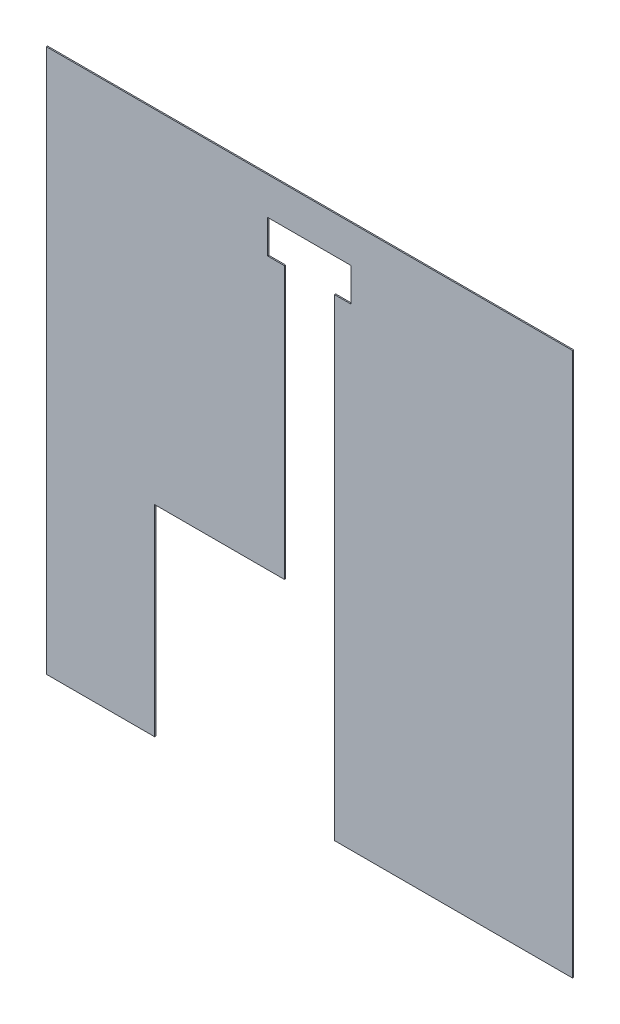
ISO-10303-21;
HEADER;
FILE_DESCRIPTION(('STEP AP214'),'2;1');
FILE_NAME('part.step','',(''),(''),'','','');
FILE_SCHEMA(('AUTOMOTIVE_DESIGN { 1 0 10303 214 1 1 1 1 }'));
ENDSEC;
DATA;
#1=APPLICATION_CONTEXT('core data for automotive mechanical design processes');
#2=APPLICATION_PROTOCOL_DEFINITION('international standard','automotive_design',2000,#1);
#3=PRODUCT_CONTEXT('',#1,'mechanical');
#4=PRODUCT('Part','Part','',(#3));
#5=PRODUCT_RELATED_PRODUCT_CATEGORY('part','',(#4));
#6=PRODUCT_DEFINITION_FORMATION('','',#4);
#7=PRODUCT_DEFINITION_CONTEXT('part definition',#1,'design');
#8=PRODUCT_DEFINITION('design','',#6,#7);
#9=PRODUCT_DEFINITION_SHAPE('','',#8);
#10=(LENGTH_UNIT() NAMED_UNIT(*) SI_UNIT(.MILLI.,.METRE.));
#11=(NAMED_UNIT(*) PLANE_ANGLE_UNIT() SI_UNIT($,.RADIAN.));
#12=(NAMED_UNIT(*) SI_UNIT($,.STERADIAN.) SOLID_ANGLE_UNIT());
#13=UNCERTAINTY_MEASURE_WITH_UNIT(LENGTH_MEASURE(1.E-05),#10,'distance_accuracy_value','');
#14=(GEOMETRIC_REPRESENTATION_CONTEXT(3) GLOBAL_UNCERTAINTY_ASSIGNED_CONTEXT((#13)) GLOBAL_UNIT_ASSIGNED_CONTEXT((#10,
#11,#12)) REPRESENTATION_CONTEXT('',''));
#15=CARTESIAN_POINT('',(0.,0.,0.));
#16=DIRECTION('',(0.,0.,1.));
#17=DIRECTION('',(1.,0.,0.));
#18=AXIS2_PLACEMENT_3D('',#15,#16,#17);
#19=CARTESIAN_POINT('',(1.59204083889156E-13,-1300.,2.9));
#20=DIRECTION('',(0.,1.,0.));
#21=DIRECTION('',(0.,0.,1.));
#22=AXIS2_PLACEMENT_3D('',#19,#20,#21);
#23=PLANE('',#22);
#24=DIRECTION('',(1.,0.,0.));
#25=VECTOR('',#24,1.);
#26=CARTESIAN_POINT('',(1.59204083889156E-13,-1300.,2.9));
#27=LINE('',#26,#25);
#28=CARTESIAN_POINT('',(689.2,-1300.,2.9));
#29=VERTEX_POINT('',#28);
#30=CARTESIAN_POINT('',(1258.4,-1300.,2.9));
#31=VERTEX_POINT('',#30);
#32=EDGE_CURVE('E185',#29,#31,#27,.T.);
#33=ORIENTED_EDGE('',*,*,#32,.F.);
#34=DIRECTION('',(0.,0.,1.));
#35=VECTOR('',#34,1.);
#36=CARTESIAN_POINT('',(689.2,-1300.,-0.1));
#37=LINE('',#36,#35);
#38=CARTESIAN_POINT('',(689.2,-1300.,0.));
#39=VERTEX_POINT('',#38);
#40=EDGE_CURVE('E241',#39,#29,#37,.T.);
#41=ORIENTED_EDGE('',*,*,#40,.F.);
#42=DIRECTION('',(1.,0.,0.));
#43=VECTOR('',#42,1.);
#44=CARTESIAN_POINT('',(1.59204083889156E-13,-1300.,0.));
#45=LINE('',#44,#43);
#46=CARTESIAN_POINT('',(1258.4,-1300.,0.));
#47=VERTEX_POINT('',#46);
#48=EDGE_CURVE('E197',#39,#47,#45,.T.);
#49=ORIENTED_EDGE('',*,*,#48,.T.);
#50=DIRECTION('',(0.,0.,-1.));
#51=VECTOR('',#50,1.);
#52=CARTESIAN_POINT('',(1258.4,-1300.,2.9));
#53=LINE('',#52,#51);
#54=EDGE_CURVE('E209',#31,#47,#53,.T.);
#55=ORIENTED_EDGE('',*,*,#54,.F.);
#56=EDGE_LOOP('',(#33,#41,#49,#55));
#57=FACE_BOUND('',#56,.T.);
#58=ADVANCED_FACE('F35',(#57),#23,.F.);
#59=CARTESIAN_POINT('',(529.2,-168.9,-7.1));
#60=DIRECTION('',(0.,-1.,0.));
#61=DIRECTION('',(1.,0.,0.));
#62=AXIS2_PLACEMENT_3D('',#59,#60,#61);
#63=PLANE('',#62);
#64=DIRECTION('',(1.,0.,0.));
#65=VECTOR('',#64,1.);
#66=CARTESIAN_POINT('',(0.,-168.9,0.));
#67=LINE('',#66,#65);
#68=CARTESIAN_POINT('',(689.2,-168.9,0.));
#69=VERTEX_POINT('',#68);
#70=CARTESIAN_POINT('',(729.2,-168.9,0.));
#71=VERTEX_POINT('',#70);
#72=EDGE_CURVE('E224',#69,#71,#67,.T.);
#73=ORIENTED_EDGE('',*,*,#72,.F.);
#74=DIRECTION('',(0.,0.,1.));
#75=VECTOR('',#74,1.);
#76=CARTESIAN_POINT('',(689.2,-168.9,-7.1));
#77=LINE('',#76,#75);
#78=CARTESIAN_POINT('',(689.2,-168.9,2.9));
#79=VERTEX_POINT('',#78);
#80=EDGE_CURVE('E143',#69,#79,#77,.T.);
#81=ORIENTED_EDGE('',*,*,#80,.T.);
#82=DIRECTION('',(1.,0.,0.));
#83=VECTOR('',#82,1.);
#84=CARTESIAN_POINT('',(529.2,-168.9,2.9));
#85=LINE('',#84,#83);
#86=CARTESIAN_POINT('',(729.2,-168.9,2.9));
#87=VERTEX_POINT('',#86);
#88=EDGE_CURVE('E160',#79,#87,#85,.T.);
#89=ORIENTED_EDGE('',*,*,#88,.T.);
#90=DIRECTION('',(0.,0.,1.));
#91=VECTOR('',#90,1.);
#92=CARTESIAN_POINT('',(729.2,-168.9,-7.1));
#93=LINE('',#92,#91);
#94=EDGE_CURVE('E173',#71,#87,#93,.T.);
#95=ORIENTED_EDGE('',*,*,#94,.F.);
#96=EDGE_LOOP('',(#73,#81,#89,#95));
#97=FACE_BOUND('',#96,.T.);
#98=ADVANCED_FACE('F275',(#97),#63,.F.);
#99=CARTESIAN_POINT('',(0.,0.,2.9));
#100=DIRECTION('',(1.,0.,0.));
#101=DIRECTION('',(0.,1.,0.));
#102=AXIS2_PLACEMENT_3D('',#99,#100,#101);
#103=PLANE('',#102);
#104=DIRECTION('',(0.,-1.,0.));
#105=VECTOR('',#104,1.);
#106=CARTESIAN_POINT('',(0.,0.,0.));
#107=LINE('',#106,#105);
#108=CARTESIAN_POINT('',(0.,0.,0.));
#109=VERTEX_POINT('',#108);
#110=CARTESIAN_POINT('',(1.59204083889156E-13,-1300.,0.));
#111=VERTEX_POINT('',#110);
#112=EDGE_CURVE('E175',#109,#111,#107,.T.);
#113=ORIENTED_EDGE('',*,*,#112,.T.);
#114=DIRECTION('',(0.,0.,-1.));
#115=VECTOR('',#114,1.);
#116=CARTESIAN_POINT('',(1.59204083889156E-13,-1300.,2.9));
#117=LINE('',#116,#115);
#118=CARTESIAN_POINT('',(1.59204083889156E-13,-1300.,2.9));
#119=VERTEX_POINT('',#118);
#120=EDGE_CURVE('E212',#119,#111,#117,.T.);
#121=ORIENTED_EDGE('',*,*,#120,.F.);
#122=DIRECTION('',(0.,-1.,0.));
#123=VECTOR('',#122,1.);
#124=CARTESIAN_POINT('',(0.,0.,2.9));
#125=LINE('',#124,#123);
#126=CARTESIAN_POINT('',(0.,0.,2.9));
#127=VERTEX_POINT('',#126);
#128=EDGE_CURVE('E182',#127,#119,#125,.T.);
#129=ORIENTED_EDGE('',*,*,#128,.F.);
#130=DIRECTION('',(0.,0.,-1.));
#131=VECTOR('',#130,1.);
#132=CARTESIAN_POINT('',(0.,0.,2.9));
#133=LINE('',#132,#131);
#134=EDGE_CURVE('E194',#127,#109,#133,.T.);
#135=ORIENTED_EDGE('',*,*,#134,.T.);
#136=EDGE_LOOP('',(#113,#121,#129,#135));
#137=FACE_BOUND('',#136,.T.);
#138=ADVANCED_FACE('F37',(#137),#103,.F.);
#139=CARTESIAN_POINT('',(259.2,-1300.,0.));
#140=VERTEX_POINT('',#139);
#141=EDGE_CURVE('E198',#111,#140,#45,.T.);
#142=ORIENTED_EDGE('',*,*,#141,.T.);
#143=DIRECTION('',(0.,0.,1.));
#144=VECTOR('',#143,1.);
#145=CARTESIAN_POINT('',(259.2,-1300.,-0.1));
#146=LINE('',#145,#144);
#147=CARTESIAN_POINT('',(259.2,-1300.,2.9));
#148=VERTEX_POINT('',#147);
#149=EDGE_CURVE('E236',#140,#148,#146,.T.);
#150=ORIENTED_EDGE('',*,*,#149,.T.);
#151=EDGE_CURVE('E187',#119,#148,#27,.T.);
#152=ORIENTED_EDGE('',*,*,#151,.F.);
#153=ORIENTED_EDGE('',*,*,#120,.T.);
#154=EDGE_LOOP('',(#142,#150,#152,#153));
#155=FACE_BOUND('',#154,.T.);
#156=ADVANCED_FACE('F251',(#155),#23,.F.);
#157=CARTESIAN_POINT('',(1258.4,0.,2.9));
#158=DIRECTION('',(-1.,0.,0.));
#159=DIRECTION('',(0.,-1.,0.));
#160=AXIS2_PLACEMENT_3D('',#157,#158,#159);
#161=PLANE('',#160);
#162=DIRECTION('',(0.,1.,0.));
#163=VECTOR('',#162,1.);
#164=CARTESIAN_POINT('',(1258.4,0.,0.));
#165=LINE('',#164,#163);
#166=CARTESIAN_POINT('',(1258.4,0.,0.));
#167=VERTEX_POINT('',#166);
#168=EDGE_CURVE('E201',#47,#167,#165,.T.);
#169=ORIENTED_EDGE('',*,*,#168,.T.);
#170=DIRECTION('',(0.,0.,-1.));
#171=VECTOR('',#170,1.);
#172=CARTESIAN_POINT('',(1258.4,0.,2.9));
#173=LINE('',#172,#171);
#174=CARTESIAN_POINT('',(1258.4,0.,2.9));
#175=VERTEX_POINT('',#174);
#176=EDGE_CURVE('E206',#175,#167,#173,.T.);
#177=ORIENTED_EDGE('',*,*,#176,.F.);
#178=DIRECTION('',(0.,1.,0.));
#179=VECTOR('',#178,1.);
#180=CARTESIAN_POINT('',(1258.4,0.,2.9));
#181=LINE('',#180,#179);
#182=EDGE_CURVE('E190',#31,#175,#181,.T.);
#183=ORIENTED_EDGE('',*,*,#182,.F.);
#184=ORIENTED_EDGE('',*,*,#54,.T.);
#185=EDGE_LOOP('',(#169,#177,#183,#184));
#186=FACE_BOUND('',#185,.T.);
#187=ADVANCED_FACE('F265',(#186),#161,.F.);
#188=CARTESIAN_POINT('',(0.,0.,2.9));
#189=DIRECTION('',(0.,-1.,0.));
#190=DIRECTION('',(0.,0.,-1.));
#191=AXIS2_PLACEMENT_3D('',#188,#189,#190);
#192=PLANE('',#191);
#193=DIRECTION('',(-1.,0.,0.));
#194=VECTOR('',#193,1.);
#195=CARTESIAN_POINT('',(0.,0.,0.));
#196=LINE('',#195,#194);
#197=EDGE_CURVE('E186',#167,#109,#196,.T.);
#198=ORIENTED_EDGE('',*,*,#197,.T.);
#199=ORIENTED_EDGE('',*,*,#134,.F.);
#200=DIRECTION('',(-1.,0.,0.));
#201=VECTOR('',#200,1.);
#202=CARTESIAN_POINT('',(0.,0.,2.9));
#203=LINE('',#202,#201);
#204=EDGE_CURVE('E192',#175,#127,#203,.T.);
#205=ORIENTED_EDGE('',*,*,#204,.F.);
#206=ORIENTED_EDGE('',*,*,#176,.T.);
#207=EDGE_LOOP('',(#198,#199,#205,#206));
#208=FACE_BOUND('',#207,.T.);
#209=ADVANCED_FACE('F261',(#208),#192,.F.);
#210=CARTESIAN_POINT('',(0.,0.,2.9));
#211=DIRECTION('',(0.,0.,1.));
#212=DIRECTION('',(1.,0.,0.));
#213=AXIS2_PLACEMENT_3D('',#210,#211,#212);
#214=PLANE('',#213);
#215=DIRECTION('',(0.,1.,0.));
#216=VECTOR('',#215,1.);
#217=CARTESIAN_POINT('',(689.2,-1300.,2.9));
#218=LINE('',#217,#216);
#219=EDGE_CURVE('E58',#29,#79,#218,.T.);
#220=ORIENTED_EDGE('',*,*,#219,.F.);
#221=ORIENTED_EDGE('',*,*,#32,.T.);
#222=ORIENTED_EDGE('',*,*,#182,.T.);
#223=ORIENTED_EDGE('',*,*,#204,.T.);
#224=ORIENTED_EDGE('',*,*,#128,.T.);
#225=ORIENTED_EDGE('',*,*,#151,.T.);
#226=DIRECTION('',(0.,-1.,0.));
#227=VECTOR('',#226,1.);
#228=CARTESIAN_POINT('',(259.2,-818.9,2.9));
#229=LINE('',#228,#227);
#230=CARTESIAN_POINT('',(259.2,-818.9,2.9));
#231=VERTEX_POINT('',#230);
#232=EDGE_CURVE('E238',#231,#148,#229,.T.);
#233=ORIENTED_EDGE('',*,*,#232,.F.);
#234=DIRECTION('',(-1.,0.,0.));
#235=VECTOR('',#234,1.);
#236=CARTESIAN_POINT('',(569.2,-818.9,2.9));
#237=LINE('',#236,#235);
#238=CARTESIAN_POINT('',(569.2,-818.9,2.9));
#239=VERTEX_POINT('',#238);
#240=EDGE_CURVE('E153',#239,#231,#237,.T.);
#241=ORIENTED_EDGE('',*,*,#240,.F.);
#242=DIRECTION('',(0.,-1.,0.));
#243=VECTOR('',#242,1.);
#244=CARTESIAN_POINT('',(569.2,-168.9,2.9));
#245=LINE('',#244,#243);
#246=CARTESIAN_POINT('',(569.2,-168.9,2.9));
#247=VERTEX_POINT('',#246);
#248=EDGE_CURVE('E138',#247,#239,#245,.T.);
#249=ORIENTED_EDGE('',*,*,#248,.F.);
#250=CARTESIAN_POINT('',(529.2,-168.9,2.9));
#251=VERTEX_POINT('',#250);
#252=EDGE_CURVE('E150',#251,#247,#85,.T.);
#253=ORIENTED_EDGE('',*,*,#252,.F.);
#254=DIRECTION('',(0.,-1.,0.));
#255=VECTOR('',#254,1.);
#256=CARTESIAN_POINT('',(529.2,-88.9000000000001,2.9));
#257=LINE('',#256,#255);
#258=CARTESIAN_POINT('',(529.2,-88.9000000000001,2.9));
#259=VERTEX_POINT('',#258);
#260=EDGE_CURVE('E171',#259,#251,#257,.T.);
#261=ORIENTED_EDGE('',*,*,#260,.F.);
#262=DIRECTION('',(-1.,0.,0.));
#263=VECTOR('',#262,1.);
#264=CARTESIAN_POINT('',(729.2,-88.9000000000001,2.9));
#265=LINE('',#264,#263);
#266=CARTESIAN_POINT('',(729.2,-88.9000000000001,2.9));
#267=VERTEX_POINT('',#266);
#268=EDGE_CURVE('E163',#267,#259,#265,.T.);
#269=ORIENTED_EDGE('',*,*,#268,.F.);
#270=DIRECTION('',(0.,1.,0.));
#271=VECTOR('',#270,1.);
#272=CARTESIAN_POINT('',(729.2,-88.9000000000001,2.9));
#273=LINE('',#272,#271);
#274=EDGE_CURVE('E159',#87,#267,#273,.T.);
#275=ORIENTED_EDGE('',*,*,#274,.F.);
#276=ORIENTED_EDGE('',*,*,#88,.F.);
#277=EDGE_LOOP('',(#220,#221,#222,#223,#224,#225,#233,#241,#249,#253,#261,#269,#275,#276));
#278=FACE_BOUND('',#277,.T.);
#279=ADVANCED_FACE('F148',(#278),#214,.T.);
#280=CARTESIAN_POINT('',(0.,0.,0.));
#281=DIRECTION('',(0.,0.,1.));
#282=DIRECTION('',(1.,0.,0.));
#283=AXIS2_PLACEMENT_3D('',#280,#281,#282);
#284=PLANE('',#283);
#285=ORIENTED_EDGE('',*,*,#48,.F.);
#286=DIRECTION('',(0.,1.,0.));
#287=VECTOR('',#286,1.);
#288=CARTESIAN_POINT('',(689.2,0.,0.));
#289=LINE('',#288,#287);
#290=EDGE_CURVE('E165',#39,#69,#289,.T.);
#291=ORIENTED_EDGE('',*,*,#290,.T.);
#292=ORIENTED_EDGE('',*,*,#72,.T.);
#293=DIRECTION('',(0.,1.,0.));
#294=VECTOR('',#293,1.);
#295=CARTESIAN_POINT('',(729.2,0.,0.));
#296=LINE('',#295,#294);
#297=CARTESIAN_POINT('',(729.2,-88.9000000000001,0.));
#298=VERTEX_POINT('',#297);
#299=EDGE_CURVE('E215',#71,#298,#296,.T.);
#300=ORIENTED_EDGE('',*,*,#299,.T.);
#301=DIRECTION('',(-1.,0.,0.));
#302=VECTOR('',#301,1.);
#303=CARTESIAN_POINT('',(0.,-88.9000000000002,0.));
#304=LINE('',#303,#302);
#305=CARTESIAN_POINT('',(529.2,-88.9000000000001,0.));
#306=VERTEX_POINT('',#305);
#307=EDGE_CURVE('E218',#298,#306,#304,.T.);
#308=ORIENTED_EDGE('',*,*,#307,.T.);
#309=DIRECTION('',(0.,-1.,0.));
#310=VECTOR('',#309,1.);
#311=CARTESIAN_POINT('',(529.2,0.,0.));
#312=LINE('',#311,#310);
#313=CARTESIAN_POINT('',(529.2,-168.9,0.));
#314=VERTEX_POINT('',#313);
#315=EDGE_CURVE('E221',#306,#314,#312,.T.);
#316=ORIENTED_EDGE('',*,*,#315,.T.);
#317=CARTESIAN_POINT('',(569.2,-168.9,0.));
#318=VERTEX_POINT('',#317);
#319=EDGE_CURVE('E144',#314,#318,#67,.T.);
#320=ORIENTED_EDGE('',*,*,#319,.T.);
#321=DIRECTION('',(0.,-1.,0.));
#322=VECTOR('',#321,1.);
#323=CARTESIAN_POINT('',(569.2,0.,0.));
#324=LINE('',#323,#322);
#325=CARTESIAN_POINT('',(569.2,-818.9,0.));
#326=VERTEX_POINT('',#325);
#327=EDGE_CURVE('E50',#318,#326,#324,.T.);
#328=ORIENTED_EDGE('',*,*,#327,.T.);
#329=DIRECTION('',(-1.,0.,0.));
#330=VECTOR('',#329,1.);
#331=CARTESIAN_POINT('',(-2.93277946730819E-13,-818.9,0.));
#332=LINE('',#331,#330);
#333=CARTESIAN_POINT('',(259.2,-818.9,0.));
#334=VERTEX_POINT('',#333);
#335=EDGE_CURVE('E43',#326,#334,#332,.T.);
#336=ORIENTED_EDGE('',*,*,#335,.T.);
#337=DIRECTION('',(0.,-1.,0.));
#338=VECTOR('',#337,1.);
#339=CARTESIAN_POINT('',(259.2,0.,0.));
#340=LINE('',#339,#338);
#341=EDGE_CURVE('E11',#334,#140,#340,.T.);
#342=ORIENTED_EDGE('',*,*,#341,.T.);
#343=ORIENTED_EDGE('',*,*,#141,.F.);
#344=ORIENTED_EDGE('',*,*,#112,.F.);
#345=ORIENTED_EDGE('',*,*,#197,.F.);
#346=ORIENTED_EDGE('',*,*,#168,.F.);
#347=EDGE_LOOP('',(#285,#291,#292,#300,#308,#316,#320,#328,#336,#342,#343,#344,#345,#346));
#348=FACE_BOUND('',#347,.T.);
#349=ADVANCED_FACE('F229',(#348),#284,.F.);
#350=ORIENTED_EDGE('',*,*,#252,.T.);
#351=DIRECTION('',(0.,0.,-1.));
#352=VECTOR('',#351,1.);
#353=CARTESIAN_POINT('',(569.2,-168.9,-7.1));
#354=LINE('',#353,#352);
#355=EDGE_CURVE('E135',#247,#318,#354,.T.);
#356=ORIENTED_EDGE('',*,*,#355,.T.);
#357=ORIENTED_EDGE('',*,*,#319,.F.);
#358=DIRECTION('',(0.,0.,1.));
#359=VECTOR('',#358,1.);
#360=CARTESIAN_POINT('',(529.2,-168.9,-7.1));
#361=LINE('',#360,#359);
#362=EDGE_CURVE('E157',#314,#251,#361,.T.);
#363=ORIENTED_EDGE('',*,*,#362,.T.);
#364=EDGE_LOOP('',(#350,#356,#357,#363));
#365=FACE_BOUND('',#364,.T.);
#366=ADVANCED_FACE('F155',(#365),#63,.F.);
#367=CARTESIAN_POINT('',(529.2,-88.9000000000001,-7.1));
#368=DIRECTION('',(-1.,0.,0.));
#369=DIRECTION('',(0.,0.,1.));
#370=AXIS2_PLACEMENT_3D('',#367,#368,#369);
#371=PLANE('',#370);
#372=DIRECTION('',(0.,0.,1.));
#373=VECTOR('',#372,1.);
#374=CARTESIAN_POINT('',(529.2,-88.9000000000001,-7.1));
#375=LINE('',#374,#373);
#376=EDGE_CURVE('E176',#306,#259,#375,.T.);
#377=ORIENTED_EDGE('',*,*,#376,.T.);
#378=ORIENTED_EDGE('',*,*,#260,.T.);
#379=ORIENTED_EDGE('',*,*,#362,.F.);
#380=ORIENTED_EDGE('',*,*,#315,.F.);
#381=EDGE_LOOP('',(#377,#378,#379,#380));
#382=FACE_BOUND('',#381,.T.);
#383=ADVANCED_FACE('F284',(#382),#371,.F.);
#384=CARTESIAN_POINT('',(729.2,-88.9000000000001,-7.1));
#385=DIRECTION('',(0.,1.,0.));
#386=DIRECTION('',(-1.,0.,0.));
#387=AXIS2_PLACEMENT_3D('',#384,#385,#386);
#388=PLANE('',#387);
#389=DIRECTION('',(0.,0.,1.));
#390=VECTOR('',#389,1.);
#391=CARTESIAN_POINT('',(729.2,-88.9000000000001,-7.1));
#392=LINE('',#391,#390);
#393=EDGE_CURVE('E178',#298,#267,#392,.T.);
#394=ORIENTED_EDGE('',*,*,#393,.T.);
#395=ORIENTED_EDGE('',*,*,#268,.T.);
#396=ORIENTED_EDGE('',*,*,#376,.F.);
#397=ORIENTED_EDGE('',*,*,#307,.F.);
#398=EDGE_LOOP('',(#394,#395,#396,#397));
#399=FACE_BOUND('',#398,.T.);
#400=ADVANCED_FACE('F282',(#399),#388,.F.);
#401=CARTESIAN_POINT('',(729.2,-88.9000000000001,-7.1));
#402=DIRECTION('',(1.,0.,0.));
#403=DIRECTION('',(0.,0.,-1.));
#404=AXIS2_PLACEMENT_3D('',#401,#402,#403);
#405=PLANE('',#404);
#406=ORIENTED_EDGE('',*,*,#94,.T.);
#407=ORIENTED_EDGE('',*,*,#274,.T.);
#408=ORIENTED_EDGE('',*,*,#393,.F.);
#409=ORIENTED_EDGE('',*,*,#299,.F.);
#410=EDGE_LOOP('',(#406,#407,#408,#409));
#411=FACE_BOUND('',#410,.T.);
#412=ADVANCED_FACE('F278',(#411),#405,.F.);
#413=CARTESIAN_POINT('',(569.2,-168.9,-0.1));
#414=DIRECTION('',(-1.,0.,0.));
#415=DIRECTION('',(0.,0.,1.));
#416=AXIS2_PLACEMENT_3D('',#413,#414,#415);
#417=PLANE('',#416);
#418=ORIENTED_EDGE('',*,*,#355,.F.);
#419=ORIENTED_EDGE('',*,*,#248,.T.);
#420=DIRECTION('',(0.,0.,1.));
#421=VECTOR('',#420,1.);
#422=CARTESIAN_POINT('',(569.2,-818.9,-0.1));
#423=LINE('',#422,#421);
#424=EDGE_CURVE('E233',#326,#239,#423,.T.);
#425=ORIENTED_EDGE('',*,*,#424,.F.);
#426=ORIENTED_EDGE('',*,*,#327,.F.);
#427=EDGE_LOOP('',(#418,#419,#425,#426));
#428=FACE_BOUND('',#427,.T.);
#429=ADVANCED_FACE('F137',(#428),#417,.F.);
#430=CARTESIAN_POINT('',(569.2,-818.9,-0.1));
#431=DIRECTION('',(0.,1.,0.));
#432=DIRECTION('',(-1.,0.,0.));
#433=AXIS2_PLACEMENT_3D('',#430,#431,#432);
#434=PLANE('',#433);
#435=ORIENTED_EDGE('',*,*,#424,.T.);
#436=ORIENTED_EDGE('',*,*,#240,.T.);
#437=DIRECTION('',(0.,0.,1.));
#438=VECTOR('',#437,1.);
#439=CARTESIAN_POINT('',(259.2,-818.9,-0.1));
#440=LINE('',#439,#438);
#441=EDGE_CURVE('E234',#334,#231,#440,.T.);
#442=ORIENTED_EDGE('',*,*,#441,.F.);
#443=ORIENTED_EDGE('',*,*,#335,.F.);
#444=EDGE_LOOP('',(#435,#436,#442,#443));
#445=FACE_BOUND('',#444,.T.);
#446=ADVANCED_FACE('F232',(#445),#434,.F.);
#447=CARTESIAN_POINT('',(259.2,-818.9,-0.1));
#448=DIRECTION('',(-1.,0.,0.));
#449=DIRECTION('',(0.,-1.,0.));
#450=AXIS2_PLACEMENT_3D('',#447,#448,#449);
#451=PLANE('',#450);
#452=ORIENTED_EDGE('',*,*,#441,.T.);
#453=ORIENTED_EDGE('',*,*,#232,.T.);
#454=ORIENTED_EDGE('',*,*,#149,.F.);
#455=ORIENTED_EDGE('',*,*,#341,.F.);
#456=EDGE_LOOP('',(#452,#453,#454,#455));
#457=FACE_BOUND('',#456,.T.);
#458=ADVANCED_FACE('F249',(#457),#451,.F.);
#459=CARTESIAN_POINT('',(689.2,-1300.,-0.1));
#460=DIRECTION('',(1.,0.,0.));
#461=DIRECTION('',(0.,0.,-1.));
#462=AXIS2_PLACEMENT_3D('',#459,#460,#461);
#463=PLANE('',#462);
#464=ORIENTED_EDGE('',*,*,#40,.T.);
#465=ORIENTED_EDGE('',*,*,#219,.T.);
#466=ORIENTED_EDGE('',*,*,#80,.F.);
#467=ORIENTED_EDGE('',*,*,#290,.F.);
#468=EDGE_LOOP('',(#464,#465,#466,#467));
#469=FACE_BOUND('',#468,.T.);
#470=ADVANCED_FACE('F370',(#469),#463,.F.);
#471=CLOSED_SHELL('',(#58,#98,#138,#156,#187,#209,#279,#349,#366,#383,#400,#412,#429,#446,#458,#470));
#472=MANIFOLD_SOLID_BREP('B2',#471);
#473=ADVANCED_BREP_SHAPE_REPRESENTATION('',(#18,#472),#14);
#474=SHAPE_DEFINITION_REPRESENTATION(#9,#473);
ENDSEC;
END-ISO-10303-21;
